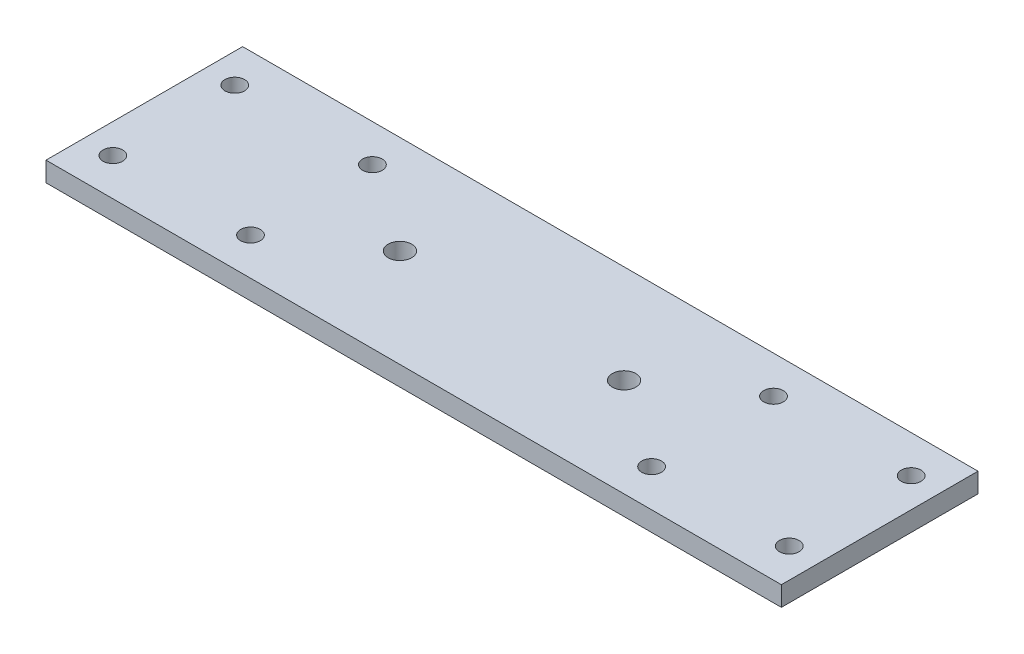
ISO-10303-21;
HEADER;
FILE_DESCRIPTION(('STEP AP214'),'2;1');
FILE_NAME('part.step','',(''),(''),'','','');
FILE_SCHEMA(('AUTOMOTIVE_DESIGN { 1 0 10303 214 1 1 1 1 }'));
ENDSEC;
DATA;
#1=APPLICATION_CONTEXT('core data for automotive mechanical design processes');
#2=APPLICATION_PROTOCOL_DEFINITION('international standard','automotive_design',2000,#1);
#3=PRODUCT_CONTEXT('',#1,'mechanical');
#4=PRODUCT('Part','Part','',(#3));
#5=PRODUCT_RELATED_PRODUCT_CATEGORY('part','',(#4));
#6=PRODUCT_DEFINITION_FORMATION('','',#4);
#7=PRODUCT_DEFINITION_CONTEXT('part definition',#1,'design');
#8=PRODUCT_DEFINITION('design','',#6,#7);
#9=PRODUCT_DEFINITION_SHAPE('','',#8);
#10=(LENGTH_UNIT() NAMED_UNIT(*) SI_UNIT(.MILLI.,.METRE.));
#11=(NAMED_UNIT(*) PLANE_ANGLE_UNIT() SI_UNIT($,.RADIAN.));
#12=(NAMED_UNIT(*) SI_UNIT($,.STERADIAN.) SOLID_ANGLE_UNIT());
#13=UNCERTAINTY_MEASURE_WITH_UNIT(LENGTH_MEASURE(1.E-05),#10,'distance_accuracy_value','');
#14=(GEOMETRIC_REPRESENTATION_CONTEXT(3) GLOBAL_UNCERTAINTY_ASSIGNED_CONTEXT((#13)) GLOBAL_UNIT_ASSIGNED_CONTEXT((#10,
#11,#12)) REPRESENTATION_CONTEXT('',''));
#15=CARTESIAN_POINT('',(0.,0.,0.));
#16=DIRECTION('',(0.,0.,1.));
#17=DIRECTION('',(1.,0.,0.));
#18=AXIS2_PLACEMENT_3D('',#15,#16,#17);
#19=CARTESIAN_POINT('',(0.,5.,0.));
#20=DIRECTION('',(1.,0.,0.));
#21=DIRECTION('',(0.,0.,-1.));
#22=AXIS2_PLACEMENT_3D('',#19,#20,#21);
#23=PLANE('',#22);
#24=DIRECTION('',(0.,0.,1.));
#25=VECTOR('',#24,1.);
#26=CARTESIAN_POINT('',(0.,0.,0.));
#27=LINE('',#26,#25);
#28=CARTESIAN_POINT('',(0.,0.,-50.));
#29=VERTEX_POINT('',#28);
#30=CARTESIAN_POINT('',(0.,0.,0.));
#31=VERTEX_POINT('',#30);
#32=EDGE_CURVE('E99',#29,#31,#27,.T.);
#33=ORIENTED_EDGE('',*,*,#32,.T.);
#34=DIRECTION('',(0.,-1.,0.));
#35=VECTOR('',#34,1.);
#36=CARTESIAN_POINT('',(0.,5.,0.));
#37=LINE('',#36,#35);
#38=CARTESIAN_POINT('',(0.,5.,0.));
#39=VERTEX_POINT('',#38);
#40=EDGE_CURVE('E11',#39,#31,#37,.T.);
#41=ORIENTED_EDGE('',*,*,#40,.F.);
#42=DIRECTION('',(0.,0.,1.));
#43=VECTOR('',#42,1.);
#44=CARTESIAN_POINT('',(0.,5.,0.));
#45=LINE('',#44,#43);
#46=CARTESIAN_POINT('',(0.,5.,-50.));
#47=VERTEX_POINT('',#46);
#48=EDGE_CURVE('E86',#47,#39,#45,.T.);
#49=ORIENTED_EDGE('',*,*,#48,.F.);
#50=DIRECTION('',(0.,-1.,0.));
#51=VECTOR('',#50,1.);
#52=CARTESIAN_POINT('',(0.,5.,-50.));
#53=LINE('',#52,#51);
#54=EDGE_CURVE('E95',#47,#29,#53,.T.);
#55=ORIENTED_EDGE('',*,*,#54,.T.);
#56=EDGE_LOOP('',(#33,#41,#49,#55));
#57=FACE_BOUND('',#56,.T.);
#58=ADVANCED_FACE('F33',(#57),#23,.F.);
#59=CARTESIAN_POINT('',(0.,5.,0.));
#60=DIRECTION('',(0.,0.,-1.));
#61=DIRECTION('',(-1.,0.,0.));
#62=AXIS2_PLACEMENT_3D('',#59,#60,#61);
#63=PLANE('',#62);
#64=DIRECTION('',(1.,0.,0.));
#65=VECTOR('',#64,1.);
#66=CARTESIAN_POINT('',(0.,0.,0.));
#67=LINE('',#66,#65);
#68=CARTESIAN_POINT('',(187.,0.,0.));
#69=VERTEX_POINT('',#68);
#70=EDGE_CURVE('E90',#31,#69,#67,.T.);
#71=ORIENTED_EDGE('',*,*,#70,.T.);
#72=DIRECTION('',(0.,-1.,0.));
#73=VECTOR('',#72,1.);
#74=CARTESIAN_POINT('',(187.,5.,0.));
#75=LINE('',#74,#73);
#76=CARTESIAN_POINT('',(187.,5.,0.));
#77=VERTEX_POINT('',#76);
#78=EDGE_CURVE('E42',#77,#69,#75,.T.);
#79=ORIENTED_EDGE('',*,*,#78,.F.);
#80=DIRECTION('',(1.,0.,0.));
#81=VECTOR('',#80,1.);
#82=CARTESIAN_POINT('',(0.,5.,0.));
#83=LINE('',#82,#81);
#84=EDGE_CURVE('E81',#39,#77,#83,.T.);
#85=ORIENTED_EDGE('',*,*,#84,.F.);
#86=ORIENTED_EDGE('',*,*,#40,.T.);
#87=EDGE_LOOP('',(#71,#79,#85,#86));
#88=FACE_BOUND('',#87,.T.);
#89=ADVANCED_FACE('F89',(#88),#63,.F.);
#90=CARTESIAN_POINT('',(187.,5.,0.));
#91=DIRECTION('',(-1.,0.,0.));
#92=DIRECTION('',(0.,0.,1.));
#93=AXIS2_PLACEMENT_3D('',#90,#91,#92);
#94=PLANE('',#93);
#95=DIRECTION('',(0.,0.,-1.));
#96=VECTOR('',#95,1.);
#97=CARTESIAN_POINT('',(187.,0.,0.));
#98=LINE('',#97,#96);
#99=CARTESIAN_POINT('',(187.,0.,-50.));
#100=VERTEX_POINT('',#99);
#101=EDGE_CURVE('E68',#69,#100,#98,.T.);
#102=ORIENTED_EDGE('',*,*,#101,.T.);
#103=DIRECTION('',(0.,-1.,0.));
#104=VECTOR('',#103,1.);
#105=CARTESIAN_POINT('',(187.,5.,-50.));
#106=LINE('',#105,#104);
#107=CARTESIAN_POINT('',(187.,5.,-50.));
#108=VERTEX_POINT('',#107);
#109=EDGE_CURVE('E91',#108,#100,#106,.T.);
#110=ORIENTED_EDGE('',*,*,#109,.F.);
#111=DIRECTION('',(0.,0.,-1.));
#112=VECTOR('',#111,1.);
#113=CARTESIAN_POINT('',(187.,5.,0.));
#114=LINE('',#113,#112);
#115=EDGE_CURVE('E84',#77,#108,#114,.T.);
#116=ORIENTED_EDGE('',*,*,#115,.F.);
#117=ORIENTED_EDGE('',*,*,#78,.T.);
#118=EDGE_LOOP('',(#102,#110,#116,#117));
#119=FACE_BOUND('',#118,.T.);
#120=ADVANCED_FACE('F93',(#119),#94,.F.);
#121=CARTESIAN_POINT('',(0.,5.,-50.));
#122=DIRECTION('',(0.,0.,1.));
#123=DIRECTION('',(1.,0.,0.));
#124=AXIS2_PLACEMENT_3D('',#121,#122,#123);
#125=PLANE('',#124);
#126=DIRECTION('',(-1.,0.,0.));
#127=VECTOR('',#126,1.);
#128=CARTESIAN_POINT('',(0.,0.,-50.));
#129=LINE('',#128,#127);
#130=EDGE_CURVE('E74',#100,#29,#129,.T.);
#131=ORIENTED_EDGE('',*,*,#130,.T.);
#132=ORIENTED_EDGE('',*,*,#54,.F.);
#133=DIRECTION('',(-1.,0.,0.));
#134=VECTOR('',#133,1.);
#135=CARTESIAN_POINT('',(0.,5.,-50.));
#136=LINE('',#135,#134);
#137=EDGE_CURVE('E51',#108,#47,#136,.T.);
#138=ORIENTED_EDGE('',*,*,#137,.F.);
#139=ORIENTED_EDGE('',*,*,#109,.T.);
#140=EDGE_LOOP('',(#131,#132,#138,#139));
#141=FACE_BOUND('',#140,.T.);
#142=ADVANCED_FACE('F173',(#141),#125,.F.);
#143=CARTESIAN_POINT('',(0.,5.,0.));
#144=DIRECTION('',(0.,-1.,0.));
#145=DIRECTION('',(0.,0.,-1.));
#146=AXIS2_PLACEMENT_3D('',#143,#144,#145);
#147=PLANE('',#146);
#148=CARTESIAN_POINT('',(7.49999999999991,5.,-9.50000000000069));
#149=DIRECTION('',(0.,1.,0.));
#150=DIRECTION('',(0.,0.,1.));
#151=AXIS2_PLACEMENT_3D('',#148,#149,#150);
#152=CIRCLE('',#151,2.5);
#153=CARTESIAN_POINT('',(7.49999999999991,5.,-7.00000000000069));
#154=VERTEX_POINT('',#153);
#155=EDGE_CURVE('E118',#154,#154,#152,.T.);
#156=ORIENTED_EDGE('',*,*,#155,.F.);
#157=EDGE_LOOP('',(#156));
#158=FACE_BOUND('',#157,.T.);
#159=CARTESIAN_POINT('',(42.5,5.,-40.5000000000006));
#160=DIRECTION('',(0.,1.,0.));
#161=DIRECTION('',(0.,0.,1.));
#162=AXIS2_PLACEMENT_3D('',#159,#160,#161);
#163=CIRCLE('',#162,2.5);
#164=CARTESIAN_POINT('',(42.5,5.,-38.0000000000006));
#165=VERTEX_POINT('',#164);
#166=EDGE_CURVE('E123',#165,#165,#163,.T.);
#167=ORIENTED_EDGE('',*,*,#166,.F.);
#168=EDGE_LOOP('',(#167));
#169=FACE_BOUND('',#168,.T.);
#170=CARTESIAN_POINT('',(42.4999999999999,5.,-9.50000000000058));
#171=DIRECTION('',(0.,1.,0.));
#172=DIRECTION('',(0.,0.,1.));
#173=AXIS2_PLACEMENT_3D('',#170,#171,#172);
#174=CIRCLE('',#173,2.5);
#175=CARTESIAN_POINT('',(42.4999999999999,5.,-7.00000000000058));
#176=VERTEX_POINT('',#175);
#177=EDGE_CURVE('E115',#176,#176,#174,.T.);
#178=ORIENTED_EDGE('',*,*,#177,.F.);
#179=EDGE_LOOP('',(#178));
#180=FACE_BOUND('',#179,.T.);
#181=CARTESIAN_POINT('',(7.50000000000002,5.,-40.5000000000007));
#182=DIRECTION('',(0.,1.,0.));
#183=DIRECTION('',(0.,0.,1.));
#184=AXIS2_PLACEMENT_3D('',#181,#182,#183);
#185=CIRCLE('',#184,2.5);
#186=CARTESIAN_POINT('',(7.50000000000002,5.,-38.0000000000007));
#187=VERTEX_POINT('',#186);
#188=EDGE_CURVE('E112',#187,#187,#185,.T.);
#189=ORIENTED_EDGE('',*,*,#188,.F.);
#190=EDGE_LOOP('',(#189));
#191=FACE_BOUND('',#190,.T.);
#192=CARTESIAN_POINT('',(144.5,5.,-9.50000000000022));
#193=DIRECTION('',(0.,1.,0.));
#194=DIRECTION('',(0.,0.,1.));
#195=AXIS2_PLACEMENT_3D('',#192,#193,#194);
#196=CIRCLE('',#195,2.50000000000002);
#197=CARTESIAN_POINT('',(144.5,5.,-7.0000000000002));
#198=VERTEX_POINT('',#197);
#199=EDGE_CURVE('E138',#198,#198,#196,.T.);
#200=ORIENTED_EDGE('',*,*,#199,.F.);
#201=EDGE_LOOP('',(#200));
#202=FACE_BOUND('',#201,.T.);
#203=CARTESIAN_POINT('',(179.5,5.,-9.5000000000001));
#204=DIRECTION('',(0.,1.,0.));
#205=DIRECTION('',(0.,0.,1.));
#206=AXIS2_PLACEMENT_3D('',#203,#204,#205);
#207=CIRCLE('',#206,2.50000000000002);
#208=CARTESIAN_POINT('',(179.5,5.,-7.00000000000008));
#209=VERTEX_POINT('',#208);
#210=EDGE_CURVE('E144',#209,#209,#207,.T.);
#211=ORIENTED_EDGE('',*,*,#210,.F.);
#212=EDGE_LOOP('',(#211));
#213=FACE_BOUND('',#212,.T.);
#214=CARTESIAN_POINT('',(179.5,5.,-40.5000000000001));
#215=DIRECTION('',(0.,1.,0.));
#216=DIRECTION('',(0.,0.,1.));
#217=AXIS2_PLACEMENT_3D('',#214,#215,#216);
#218=CIRCLE('',#217,2.5);
#219=CARTESIAN_POINT('',(179.5,5.,-38.0000000000001));
#220=VERTEX_POINT('',#219);
#221=EDGE_CURVE('E111',#220,#220,#218,.T.);
#222=ORIENTED_EDGE('',*,*,#221,.F.);
#223=EDGE_LOOP('',(#222));
#224=FACE_BOUND('',#223,.T.);
#225=CARTESIAN_POINT('',(144.5,5.,-40.5000000000002));
#226=DIRECTION('',(0.,1.,0.));
#227=DIRECTION('',(0.,0.,1.));
#228=AXIS2_PLACEMENT_3D('',#225,#226,#227);
#229=CIRCLE('',#228,2.49999999999999);
#230=CARTESIAN_POINT('',(144.5,5.,-38.0000000000002));
#231=VERTEX_POINT('',#230);
#232=EDGE_CURVE('E137',#231,#231,#229,.T.);
#233=ORIENTED_EDGE('',*,*,#232,.F.);
#234=EDGE_LOOP('',(#233));
#235=FACE_BOUND('',#234,.T.);
#236=CARTESIAN_POINT('',(122.,5.,-25.));
#237=DIRECTION('',(0.,1.,0.));
#238=DIRECTION('',(0.,0.,1.));
#239=AXIS2_PLACEMENT_3D('',#236,#237,#238);
#240=CIRCLE('',#239,3.00000000000001);
#241=CARTESIAN_POINT('',(122.,5.,-22.));
#242=VERTEX_POINT('',#241);
#243=EDGE_CURVE('E155',#242,#242,#240,.T.);
#244=ORIENTED_EDGE('',*,*,#243,.F.);
#245=EDGE_LOOP('',(#244));
#246=FACE_BOUND('',#245,.T.);
#247=CARTESIAN_POINT('',(65.,5.,-25.));
#248=DIRECTION('',(0.,1.,0.));
#249=DIRECTION('',(0.,0.,1.));
#250=AXIS2_PLACEMENT_3D('',#247,#248,#249);
#251=CIRCLE('',#250,3.00000000000001);
#252=CARTESIAN_POINT('',(65.,5.,-22.));
#253=VERTEX_POINT('',#252);
#254=EDGE_CURVE('E161',#253,#253,#251,.T.);
#255=ORIENTED_EDGE('',*,*,#254,.F.);
#256=EDGE_LOOP('',(#255));
#257=FACE_BOUND('',#256,.T.);
#258=ORIENTED_EDGE('',*,*,#48,.T.);
#259=ORIENTED_EDGE('',*,*,#84,.T.);
#260=ORIENTED_EDGE('',*,*,#115,.T.);
#261=ORIENTED_EDGE('',*,*,#137,.T.);
#262=EDGE_LOOP('',(#258,#259,#260,#261));
#263=FACE_BOUND('',#262,.T.);
#264=ADVANCED_FACE('F82',(#158,#169,#180,#191,#202,#213,#224,#235,#246,#257,#263),#147,.F.);
#265=CARTESIAN_POINT('',(0.,0.,0.));
#266=DIRECTION('',(0.,-1.,0.));
#267=DIRECTION('',(0.,0.,-1.));
#268=AXIS2_PLACEMENT_3D('',#265,#266,#267);
#269=PLANE('',#268);
#270=CARTESIAN_POINT('',(7.49999999999991,0.,-9.50000000000069));
#271=DIRECTION('',(0.,-1.,0.));
#272=DIRECTION('',(0.,0.,-1.));
#273=AXIS2_PLACEMENT_3D('',#270,#271,#272);
#274=CIRCLE('',#273,2.5);
#275=CARTESIAN_POINT('',(7.49999999999991,0.,-12.0000000000007));
#276=VERTEX_POINT('',#275);
#277=EDGE_CURVE('E36',#276,#276,#274,.T.);
#278=ORIENTED_EDGE('',*,*,#277,.F.);
#279=EDGE_LOOP('',(#278));
#280=FACE_BOUND('',#279,.T.);
#281=CARTESIAN_POINT('',(42.5,0.,-40.5000000000006));
#282=DIRECTION('',(0.,-1.,0.));
#283=DIRECTION('',(0.,0.,-1.));
#284=AXIS2_PLACEMENT_3D('',#281,#282,#283);
#285=CIRCLE('',#284,2.5);
#286=CARTESIAN_POINT('',(42.5,0.,-43.0000000000006));
#287=VERTEX_POINT('',#286);
#288=EDGE_CURVE('E116',#287,#287,#285,.T.);
#289=ORIENTED_EDGE('',*,*,#288,.F.);
#290=EDGE_LOOP('',(#289));
#291=FACE_BOUND('',#290,.T.);
#292=CARTESIAN_POINT('',(42.4999999999999,0.,-9.50000000000058));
#293=DIRECTION('',(0.,-1.,0.));
#294=DIRECTION('',(0.,0.,-1.));
#295=AXIS2_PLACEMENT_3D('',#292,#293,#294);
#296=CIRCLE('',#295,2.5);
#297=CARTESIAN_POINT('',(42.4999999999999,0.,-12.0000000000006));
#298=VERTEX_POINT('',#297);
#299=EDGE_CURVE('E113',#298,#298,#296,.T.);
#300=ORIENTED_EDGE('',*,*,#299,.F.);
#301=EDGE_LOOP('',(#300));
#302=FACE_BOUND('',#301,.T.);
#303=CARTESIAN_POINT('',(7.50000000000002,0.,-40.5000000000007));
#304=DIRECTION('',(0.,-1.,0.));
#305=DIRECTION('',(0.,0.,-1.));
#306=AXIS2_PLACEMENT_3D('',#303,#304,#305);
#307=CIRCLE('',#306,2.5);
#308=CARTESIAN_POINT('',(7.50000000000002,0.,-43.0000000000007));
#309=VERTEX_POINT('',#308);
#310=EDGE_CURVE('E108',#309,#309,#307,.T.);
#311=ORIENTED_EDGE('',*,*,#310,.F.);
#312=EDGE_LOOP('',(#311));
#313=FACE_BOUND('',#312,.T.);
#314=CARTESIAN_POINT('',(144.5,0.,-9.50000000000022));
#315=DIRECTION('',(0.,1.,0.));
#316=DIRECTION('',(0.,0.,1.));
#317=AXIS2_PLACEMENT_3D('',#314,#315,#316);
#318=CIRCLE('',#317,2.50000000000002);
#319=CARTESIAN_POINT('',(144.5,0.,-7.0000000000002));
#320=VERTEX_POINT('',#319);
#321=EDGE_CURVE('E134',#320,#320,#318,.T.);
#322=ORIENTED_EDGE('',*,*,#321,.T.);
#323=EDGE_LOOP('',(#322));
#324=FACE_BOUND('',#323,.T.);
#325=CARTESIAN_POINT('',(179.5,0.,-9.5000000000001));
#326=DIRECTION('',(0.,1.,0.));
#327=DIRECTION('',(0.,0.,1.));
#328=AXIS2_PLACEMENT_3D('',#325,#326,#327);
#329=CIRCLE('',#328,2.50000000000002);
#330=CARTESIAN_POINT('',(179.5,0.,-7.00000000000008));
#331=VERTEX_POINT('',#330);
#332=EDGE_CURVE('E141',#331,#331,#329,.T.);
#333=ORIENTED_EDGE('',*,*,#332,.T.);
#334=EDGE_LOOP('',(#333));
#335=FACE_BOUND('',#334,.T.);
#336=CARTESIAN_POINT('',(179.5,0.,-40.5000000000001));
#337=DIRECTION('',(0.,1.,0.));
#338=DIRECTION('',(0.,0.,1.));
#339=AXIS2_PLACEMENT_3D('',#336,#337,#338);
#340=CIRCLE('',#339,2.5);
#341=CARTESIAN_POINT('',(179.5,0.,-38.0000000000001));
#342=VERTEX_POINT('',#341);
#343=EDGE_CURVE('E147',#342,#342,#340,.T.);
#344=ORIENTED_EDGE('',*,*,#343,.T.);
#345=EDGE_LOOP('',(#344));
#346=FACE_BOUND('',#345,.T.);
#347=CARTESIAN_POINT('',(144.5,0.,-40.5000000000002));
#348=DIRECTION('',(0.,1.,0.));
#349=DIRECTION('',(0.,0.,1.));
#350=AXIS2_PLACEMENT_3D('',#347,#348,#349);
#351=CIRCLE('',#350,2.49999999999999);
#352=CARTESIAN_POINT('',(144.5,0.,-38.0000000000002));
#353=VERTEX_POINT('',#352);
#354=EDGE_CURVE('E152',#353,#353,#351,.T.);
#355=ORIENTED_EDGE('',*,*,#354,.T.);
#356=EDGE_LOOP('',(#355));
#357=FACE_BOUND('',#356,.T.);
#358=CARTESIAN_POINT('',(122.,0.,-25.));
#359=DIRECTION('',(0.,1.,0.));
#360=DIRECTION('',(0.,0.,1.));
#361=AXIS2_PLACEMENT_3D('',#358,#359,#360);
#362=CIRCLE('',#361,3.00000000000001);
#363=CARTESIAN_POINT('',(122.,0.,-22.));
#364=VERTEX_POINT('',#363);
#365=EDGE_CURVE('E158',#364,#364,#362,.T.);
#366=ORIENTED_EDGE('',*,*,#365,.T.);
#367=EDGE_LOOP('',(#366));
#368=FACE_BOUND('',#367,.T.);
#369=CARTESIAN_POINT('',(65.,0.,-25.));
#370=DIRECTION('',(0.,1.,0.));
#371=DIRECTION('',(0.,0.,1.));
#372=AXIS2_PLACEMENT_3D('',#369,#370,#371);
#373=CIRCLE('',#372,3.00000000000001);
#374=CARTESIAN_POINT('',(65.,0.,-22.));
#375=VERTEX_POINT('',#374);
#376=EDGE_CURVE('E102',#375,#375,#373,.T.);
#377=ORIENTED_EDGE('',*,*,#376,.T.);
#378=EDGE_LOOP('',(#377));
#379=FACE_BOUND('',#378,.T.);
#380=ORIENTED_EDGE('',*,*,#32,.F.);
#381=ORIENTED_EDGE('',*,*,#130,.F.);
#382=ORIENTED_EDGE('',*,*,#101,.F.);
#383=ORIENTED_EDGE('',*,*,#70,.F.);
#384=EDGE_LOOP('',(#380,#381,#382,#383));
#385=FACE_BOUND('',#384,.T.);
#386=ADVANCED_FACE('F172',(#280,#291,#302,#313,#324,#335,#346,#357,#368,#379,#385),#269,.T.);
#387=CARTESIAN_POINT('',(65.,0.,-25.));
#388=DIRECTION('',(0.,1.,0.));
#389=DIRECTION('',(0.,0.,1.));
#390=AXIS2_PLACEMENT_3D('',#387,#388,#389);
#391=CYLINDRICAL_SURFACE('',#390,3.00000000000001);
#392=ORIENTED_EDGE('',*,*,#376,.F.);
#393=EDGE_LOOP('',(#392));
#394=FACE_BOUND('',#393,.T.);
#395=ORIENTED_EDGE('',*,*,#254,.T.);
#396=EDGE_LOOP('',(#395));
#397=FACE_BOUND('',#396,.T.);
#398=ADVANCED_FACE('F169',(#394,#397),#391,.F.);
#399=CARTESIAN_POINT('',(122.,0.,-25.));
#400=DIRECTION('',(0.,1.,0.));
#401=DIRECTION('',(0.,0.,1.));
#402=AXIS2_PLACEMENT_3D('',#399,#400,#401);
#403=CYLINDRICAL_SURFACE('',#402,3.00000000000001);
#404=ORIENTED_EDGE('',*,*,#365,.F.);
#405=EDGE_LOOP('',(#404));
#406=FACE_BOUND('',#405,.T.);
#407=ORIENTED_EDGE('',*,*,#243,.T.);
#408=EDGE_LOOP('',(#407));
#409=FACE_BOUND('',#408,.T.);
#410=ADVANCED_FACE('F221',(#406,#409),#403,.F.);
#411=CARTESIAN_POINT('',(144.5,0.,-40.5000000000002));
#412=DIRECTION('',(0.,1.,0.));
#413=DIRECTION('',(0.,0.,1.));
#414=AXIS2_PLACEMENT_3D('',#411,#412,#413);
#415=CYLINDRICAL_SURFACE('',#414,2.49999999999999);
#416=ORIENTED_EDGE('',*,*,#354,.F.);
#417=EDGE_LOOP('',(#416));
#418=FACE_BOUND('',#417,.T.);
#419=ORIENTED_EDGE('',*,*,#232,.T.);
#420=EDGE_LOOP('',(#419));
#421=FACE_BOUND('',#420,.T.);
#422=ADVANCED_FACE('F227',(#418,#421),#415,.F.);
#423=CARTESIAN_POINT('',(179.5,0.,-40.5000000000001));
#424=DIRECTION('',(0.,1.,0.));
#425=DIRECTION('',(0.,0.,1.));
#426=AXIS2_PLACEMENT_3D('',#423,#424,#425);
#427=CYLINDRICAL_SURFACE('',#426,2.5);
#428=ORIENTED_EDGE('',*,*,#343,.F.);
#429=EDGE_LOOP('',(#428));
#430=FACE_BOUND('',#429,.T.);
#431=ORIENTED_EDGE('',*,*,#221,.T.);
#432=EDGE_LOOP('',(#431));
#433=FACE_BOUND('',#432,.T.);
#434=ADVANCED_FACE('F235',(#430,#433),#427,.F.);
#435=CARTESIAN_POINT('',(179.5,0.,-9.5000000000001));
#436=DIRECTION('',(0.,1.,0.));
#437=DIRECTION('',(0.,0.,1.));
#438=AXIS2_PLACEMENT_3D('',#435,#436,#437);
#439=CYLINDRICAL_SURFACE('',#438,2.50000000000002);
#440=ORIENTED_EDGE('',*,*,#332,.F.);
#441=EDGE_LOOP('',(#440));
#442=FACE_BOUND('',#441,.T.);
#443=ORIENTED_EDGE('',*,*,#210,.T.);
#444=EDGE_LOOP('',(#443));
#445=FACE_BOUND('',#444,.T.);
#446=ADVANCED_FACE('F243',(#442,#445),#439,.F.);
#447=CARTESIAN_POINT('',(144.5,0.,-9.50000000000022));
#448=DIRECTION('',(0.,1.,0.));
#449=DIRECTION('',(0.,0.,1.));
#450=AXIS2_PLACEMENT_3D('',#447,#448,#449);
#451=CYLINDRICAL_SURFACE('',#450,2.50000000000002);
#452=ORIENTED_EDGE('',*,*,#321,.F.);
#453=EDGE_LOOP('',(#452));
#454=FACE_BOUND('',#453,.T.);
#455=ORIENTED_EDGE('',*,*,#199,.T.);
#456=EDGE_LOOP('',(#455));
#457=FACE_BOUND('',#456,.T.);
#458=ADVANCED_FACE('F251',(#454,#457),#451,.F.);
#459=CARTESIAN_POINT('',(7.50000000000002,-20.,-40.5000000000007));
#460=DIRECTION('',(0.,1.,0.));
#461=DIRECTION('',(0.,0.,1.));
#462=AXIS2_PLACEMENT_3D('',#459,#460,#461);
#463=CYLINDRICAL_SURFACE('',#462,2.5);
#464=ORIENTED_EDGE('',*,*,#310,.T.);
#465=EDGE_LOOP('',(#464));
#466=FACE_BOUND('',#465,.T.);
#467=ORIENTED_EDGE('',*,*,#188,.T.);
#468=EDGE_LOOP('',(#467));
#469=FACE_BOUND('',#468,.T.);
#470=ADVANCED_FACE('F259',(#466,#469),#463,.F.);
#471=CARTESIAN_POINT('',(42.4999999999999,-20.,-9.50000000000058));
#472=DIRECTION('',(0.,1.,0.));
#473=DIRECTION('',(0.,0.,1.));
#474=AXIS2_PLACEMENT_3D('',#471,#472,#473);
#475=CYLINDRICAL_SURFACE('',#474,2.5);
#476=ORIENTED_EDGE('',*,*,#299,.T.);
#477=EDGE_LOOP('',(#476));
#478=FACE_BOUND('',#477,.T.);
#479=ORIENTED_EDGE('',*,*,#177,.T.);
#480=EDGE_LOOP('',(#479));
#481=FACE_BOUND('',#480,.T.);
#482=ADVANCED_FACE('F266',(#478,#481),#475,.F.);
#483=CARTESIAN_POINT('',(42.5,-20.,-40.5000000000006));
#484=DIRECTION('',(0.,1.,0.));
#485=DIRECTION('',(0.,0.,1.));
#486=AXIS2_PLACEMENT_3D('',#483,#484,#485);
#487=CYLINDRICAL_SURFACE('',#486,2.5);
#488=ORIENTED_EDGE('',*,*,#288,.T.);
#489=EDGE_LOOP('',(#488));
#490=FACE_BOUND('',#489,.T.);
#491=ORIENTED_EDGE('',*,*,#166,.T.);
#492=EDGE_LOOP('',(#491));
#493=FACE_BOUND('',#492,.T.);
#494=ADVANCED_FACE('F273',(#490,#493),#487,.F.);
#495=CARTESIAN_POINT('',(7.49999999999991,-20.,-9.50000000000069));
#496=DIRECTION('',(0.,1.,0.));
#497=DIRECTION('',(0.,0.,1.));
#498=AXIS2_PLACEMENT_3D('',#495,#496,#497);
#499=CYLINDRICAL_SURFACE('',#498,2.5);
#500=ORIENTED_EDGE('',*,*,#277,.T.);
#501=EDGE_LOOP('',(#500));
#502=FACE_BOUND('',#501,.T.);
#503=ORIENTED_EDGE('',*,*,#155,.T.);
#504=EDGE_LOOP('',(#503));
#505=FACE_BOUND('',#504,.T.);
#506=ADVANCED_FACE('F281',(#502,#505),#499,.F.);
#507=CLOSED_SHELL('',(#58,#89,#120,#142,#264,#386,#398,#410,#422,#434,#446,#458,#470,#482,#494,#506));
#508=MANIFOLD_SOLID_BREP('B2',#507);
#509=ADVANCED_BREP_SHAPE_REPRESENTATION('',(#18,#508),#14);
#510=SHAPE_DEFINITION_REPRESENTATION(#9,#509);
ENDSEC;
END-ISO-10303-21;
